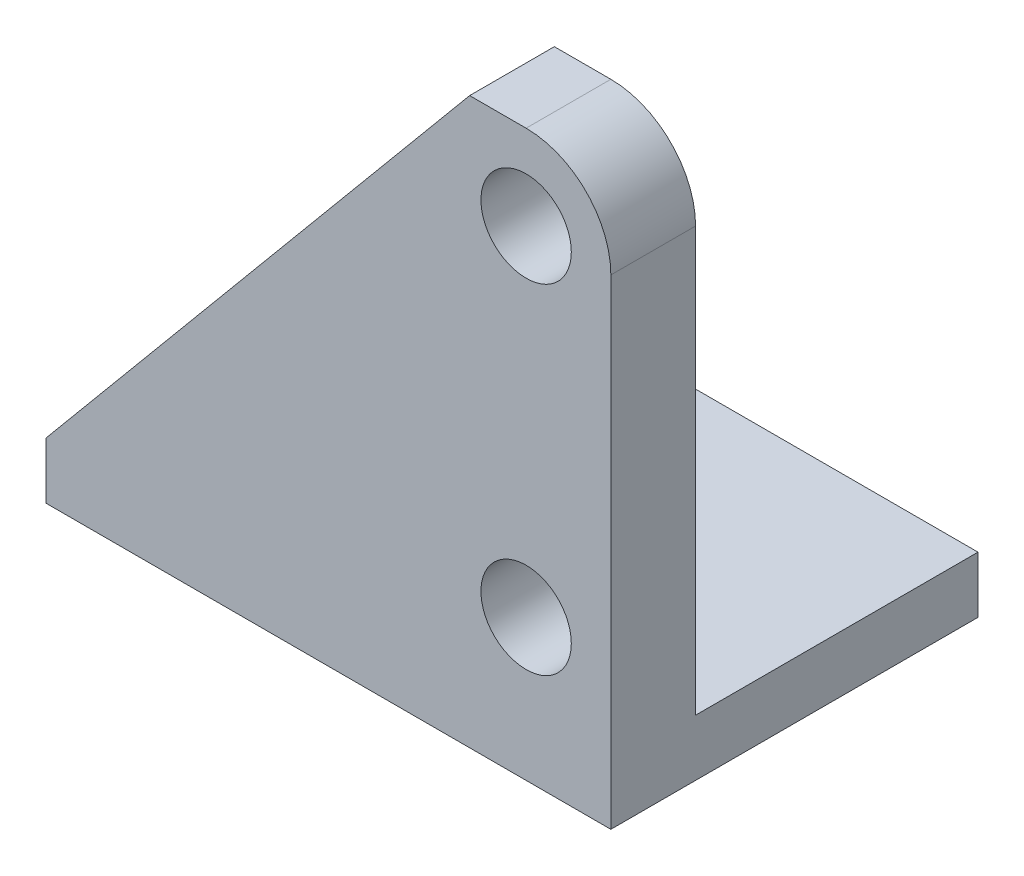
ISO-10303-21;
HEADER;
FILE_DESCRIPTION(('STEP AP214'),'2;1');
FILE_NAME('part.step','',(''),(''),'','','');
FILE_SCHEMA(('AUTOMOTIVE_DESIGN { 1 0 10303 214 1 1 1 1 }'));
ENDSEC;
DATA;
#1=APPLICATION_CONTEXT('core data for automotive mechanical design processes');
#2=APPLICATION_PROTOCOL_DEFINITION('international standard','automotive_design',2000,#1);
#3=PRODUCT_CONTEXT('',#1,'mechanical');
#4=PRODUCT('Part','Part','',(#3));
#5=PRODUCT_RELATED_PRODUCT_CATEGORY('part','',(#4));
#6=PRODUCT_DEFINITION_FORMATION('','',#4);
#7=PRODUCT_DEFINITION_CONTEXT('part definition',#1,'design');
#8=PRODUCT_DEFINITION('design','',#6,#7);
#9=PRODUCT_DEFINITION_SHAPE('','',#8);
#10=(LENGTH_UNIT() NAMED_UNIT(*) SI_UNIT(.MILLI.,.METRE.));
#11=(NAMED_UNIT(*) PLANE_ANGLE_UNIT() SI_UNIT($,.RADIAN.));
#12=(NAMED_UNIT(*) SI_UNIT($,.STERADIAN.) SOLID_ANGLE_UNIT());
#13=UNCERTAINTY_MEASURE_WITH_UNIT(LENGTH_MEASURE(1.E-05),#10,'distance_accuracy_value','');
#14=(GEOMETRIC_REPRESENTATION_CONTEXT(3) GLOBAL_UNCERTAINTY_ASSIGNED_CONTEXT((#13)) GLOBAL_UNIT_ASSIGNED_CONTEXT((#10,
#11,#12)) REPRESENTATION_CONTEXT('',''));
#15=CARTESIAN_POINT('',(0.,0.,0.));
#16=DIRECTION('',(0.,0.,1.));
#17=DIRECTION('',(1.,0.,0.));
#18=AXIS2_PLACEMENT_3D('',#15,#16,#17);
#19=CARTESIAN_POINT('',(17.,17.,3.));
#20=DIRECTION('',(0.,0.,1.));
#21=DIRECTION('',(1.,0.,0.));
#22=AXIS2_PLACEMENT_3D('',#19,#20,#21);
#23=PLANE('',#22);
#24=DIRECTION('',(0.64018439966448,0.768221279597376,0.));
#25=VECTOR('',#24,1.);
#26=CARTESIAN_POINT('',(0.,1.99999999999999,3.));
#27=LINE('',#26,#25);
#28=CARTESIAN_POINT('',(0.,1.99999999999999,3.));
#29=VERTEX_POINT('',#28);
#30=CARTESIAN_POINT('',(15.,20.,3.));
#31=VERTEX_POINT('',#30);
#32=EDGE_CURVE('E50',#29,#31,#27,.T.);
#33=ORIENTED_EDGE('',*,*,#32,.F.);
#34=DIRECTION('',(0.,-1.,0.));
#35=VECTOR('',#34,1.);
#36=CARTESIAN_POINT('',(0.,0.,3.));
#37=LINE('',#36,#35);
#38=CARTESIAN_POINT('',(0.,0.,3.));
#39=VERTEX_POINT('',#38);
#40=EDGE_CURVE('E80',#29,#39,#37,.T.);
#41=ORIENTED_EDGE('',*,*,#40,.T.);
#42=DIRECTION('',(1.,0.,0.));
#43=VECTOR('',#42,1.);
#44=CARTESIAN_POINT('',(0.,0.,3.));
#45=LINE('',#44,#43);
#46=CARTESIAN_POINT('',(20.,0.,3.));
#47=VERTEX_POINT('',#46);
#48=EDGE_CURVE('E117',#39,#47,#45,.T.);
#49=ORIENTED_EDGE('',*,*,#48,.T.);
#50=DIRECTION('',(0.,1.,0.));
#51=VECTOR('',#50,1.);
#52=CARTESIAN_POINT('',(20.,0.,3.));
#53=LINE('',#52,#51);
#54=CARTESIAN_POINT('',(20.,17.,3.));
#55=VERTEX_POINT('',#54);
#56=EDGE_CURVE('E120',#47,#55,#53,.T.);
#57=ORIENTED_EDGE('',*,*,#56,.T.);
#58=CARTESIAN_POINT('',(17.,17.,3.));
#59=DIRECTION('',(0.,0.,1.));
#60=DIRECTION('',(1.,0.,0.));
#61=AXIS2_PLACEMENT_3D('',#58,#59,#60);
#62=CIRCLE('',#61,3.);
#63=CARTESIAN_POINT('',(17.,20.,3.));
#64=VERTEX_POINT('',#63);
#65=EDGE_CURVE('E59',#55,#64,#62,.T.);
#66=ORIENTED_EDGE('',*,*,#65,.T.);
#67=DIRECTION('',(-1.,0.,0.));
#68=VECTOR('',#67,1.);
#69=CARTESIAN_POINT('',(0.,20.,3.));
#70=LINE('',#69,#68);
#71=EDGE_CURVE('E113',#64,#31,#70,.T.);
#72=ORIENTED_EDGE('',*,*,#71,.T.);
#73=EDGE_LOOP('',(#33,#41,#49,#57,#66,#72));
#74=FACE_BOUND('',#73,.T.);
#75=CARTESIAN_POINT('',(17.,17.,3.));
#76=DIRECTION('',(0.,0.,1.));
#77=DIRECTION('',(1.,0.,0.));
#78=AXIS2_PLACEMENT_3D('',#75,#76,#77);
#79=CIRCLE('',#78,1.6);
#80=CARTESIAN_POINT('',(18.6,17.,3.));
#81=VERTEX_POINT('',#80);
#82=EDGE_CURVE('E134',#81,#81,#79,.T.);
#83=ORIENTED_EDGE('',*,*,#82,.F.);
#84=EDGE_LOOP('',(#83));
#85=FACE_BOUND('',#84,.T.);
#86=CARTESIAN_POINT('',(17.0000000000002,5.,3.));
#87=DIRECTION('',(0.,0.,1.));
#88=DIRECTION('',(1.,0.,0.));
#89=AXIS2_PLACEMENT_3D('',#86,#87,#88);
#90=CIRCLE('',#89,1.6);
#91=CARTESIAN_POINT('',(18.6000000000002,5.,3.));
#92=VERTEX_POINT('',#91);
#93=EDGE_CURVE('E172',#92,#92,#90,.T.);
#94=ORIENTED_EDGE('',*,*,#93,.F.);
#95=EDGE_LOOP('',(#94));
#96=FACE_BOUND('',#95,.T.);
#97=ADVANCED_FACE('F35',(#74,#85,#96),#23,.T.);
#98=CARTESIAN_POINT('',(17.,17.,0.));
#99=DIRECTION('',(0.,0.,1.));
#100=DIRECTION('',(1.,0.,0.));
#101=AXIS2_PLACEMENT_3D('',#98,#99,#100);
#102=PLANE('',#101);
#103=DIRECTION('',(-1.,0.,0.));
#104=VECTOR('',#103,1.);
#105=CARTESIAN_POINT('',(17.,2.,0.));
#106=LINE('',#105,#104);
#107=CARTESIAN_POINT('',(20.,2.,0.));
#108=VERTEX_POINT('',#107);
#109=CARTESIAN_POINT('',(0.,1.99999999999999,0.));
#110=VERTEX_POINT('',#109);
#111=EDGE_CURVE('E167',#108,#110,#106,.T.);
#112=ORIENTED_EDGE('',*,*,#111,.T.);
#113=DIRECTION('',(0.64018439966448,0.768221279597376,0.));
#114=VECTOR('',#113,1.);
#115=CARTESIAN_POINT('',(14.344262295082,19.2131147540984,0.));
#116=LINE('',#115,#114);
#117=CARTESIAN_POINT('',(15.,20.,0.));
#118=VERTEX_POINT('',#117);
#119=EDGE_CURVE('E106',#110,#118,#116,.T.);
#120=ORIENTED_EDGE('',*,*,#119,.T.);
#121=DIRECTION('',(-1.,0.,0.));
#122=VECTOR('',#121,1.);
#123=CARTESIAN_POINT('',(0.,20.,0.));
#124=LINE('',#123,#122);
#125=CARTESIAN_POINT('',(17.,20.,0.));
#126=VERTEX_POINT('',#125);
#127=EDGE_CURVE('E118',#126,#118,#124,.T.);
#128=ORIENTED_EDGE('',*,*,#127,.F.);
#129=CARTESIAN_POINT('',(17.,17.,0.));
#130=DIRECTION('',(0.,0.,1.));
#131=DIRECTION('',(1.,0.,0.));
#132=AXIS2_PLACEMENT_3D('',#129,#130,#131);
#133=CIRCLE('',#132,3.);
#134=CARTESIAN_POINT('',(20.,17.,0.));
#135=VERTEX_POINT('',#134);
#136=EDGE_CURVE('E74',#135,#126,#133,.T.);
#137=ORIENTED_EDGE('',*,*,#136,.F.);
#138=DIRECTION('',(0.,1.,0.));
#139=VECTOR('',#138,1.);
#140=CARTESIAN_POINT('',(20.,0.,0.));
#141=LINE('',#140,#139);
#142=EDGE_CURVE('E132',#108,#135,#141,.T.);
#143=ORIENTED_EDGE('',*,*,#142,.F.);
#144=EDGE_LOOP('',(#112,#120,#128,#137,#143));
#145=FACE_BOUND('',#144,.T.);
#146=CARTESIAN_POINT('',(17.,17.,0.));
#147=DIRECTION('',(0.,0.,1.));
#148=DIRECTION('',(1.,0.,0.));
#149=AXIS2_PLACEMENT_3D('',#146,#147,#148);
#150=CIRCLE('',#149,1.6);
#151=CARTESIAN_POINT('',(18.6,17.,0.));
#152=VERTEX_POINT('',#151);
#153=EDGE_CURVE('E125',#152,#152,#150,.T.);
#154=ORIENTED_EDGE('',*,*,#153,.T.);
#155=EDGE_LOOP('',(#154));
#156=FACE_BOUND('',#155,.T.);
#157=CARTESIAN_POINT('',(17.0000000000002,5.,0.));
#158=DIRECTION('',(0.,0.,1.));
#159=DIRECTION('',(1.,0.,0.));
#160=AXIS2_PLACEMENT_3D('',#157,#158,#159);
#161=CIRCLE('',#160,1.6);
#162=CARTESIAN_POINT('',(18.6000000000002,5.,0.));
#163=VERTEX_POINT('',#162);
#164=EDGE_CURVE('E171',#163,#163,#161,.T.);
#165=ORIENTED_EDGE('',*,*,#164,.T.);
#166=EDGE_LOOP('',(#165));
#167=FACE_BOUND('',#166,.T.);
#168=ADVANCED_FACE('F182',(#145,#156,#167),#102,.F.);
#169=CARTESIAN_POINT('',(0.,0.,3.));
#170=DIRECTION('',(1.,0.,0.));
#171=DIRECTION('',(0.,0.,-1.));
#172=AXIS2_PLACEMENT_3D('',#169,#170,#171);
#173=PLANE('',#172);
#174=ORIENTED_EDGE('',*,*,#40,.F.);
#175=DIRECTION('',(0.,0.,1.));
#176=VECTOR('',#175,1.);
#177=CARTESIAN_POINT('',(0.,1.99999999999999,-17.));
#178=LINE('',#177,#176);
#179=EDGE_CURVE('E103',#110,#29,#178,.T.);
#180=ORIENTED_EDGE('',*,*,#179,.F.);
#181=DIRECTION('',(0.,0.,1.));
#182=VECTOR('',#181,1.);
#183=CARTESIAN_POINT('',(0.,1.99999999999999,-10.));
#184=LINE('',#183,#182);
#185=CARTESIAN_POINT('',(0.,1.99999999999999,-10.));
#186=VERTEX_POINT('',#185);
#187=EDGE_CURVE('E162',#186,#110,#184,.T.);
#188=ORIENTED_EDGE('',*,*,#187,.F.);
#189=DIRECTION('',(0.,-1.,0.));
#190=VECTOR('',#189,1.);
#191=CARTESIAN_POINT('',(0.,0.,-10.));
#192=LINE('',#191,#190);
#193=CARTESIAN_POINT('',(0.,0.,-10.));
#194=VERTEX_POINT('',#193);
#195=EDGE_CURVE('E160',#186,#194,#192,.T.);
#196=ORIENTED_EDGE('',*,*,#195,.T.);
#197=DIRECTION('',(0.,0.,-1.));
#198=VECTOR('',#197,1.);
#199=CARTESIAN_POINT('',(0.,0.,3.));
#200=LINE('',#199,#198);
#201=EDGE_CURVE('E11',#39,#194,#200,.T.);
#202=ORIENTED_EDGE('',*,*,#201,.F.);
#203=EDGE_LOOP('',(#174,#180,#188,#196,#202));
#204=FACE_BOUND('',#203,.T.);
#205=ADVANCED_FACE('F37',(#204),#173,.F.);
#206=CARTESIAN_POINT('',(0.,0.,3.));
#207=DIRECTION('',(0.,1.,0.));
#208=DIRECTION('',(0.,0.,1.));
#209=AXIS2_PLACEMENT_3D('',#206,#207,#208);
#210=PLANE('',#209);
#211=ORIENTED_EDGE('',*,*,#201,.T.);
#212=DIRECTION('',(1.,0.,0.));
#213=VECTOR('',#212,1.);
#214=CARTESIAN_POINT('',(20.,0.,-10.));
#215=LINE('',#214,#213);
#216=CARTESIAN_POINT('',(20.,0.,-10.));
#217=VERTEX_POINT('',#216);
#218=EDGE_CURVE('E154',#194,#217,#215,.T.);
#219=ORIENTED_EDGE('',*,*,#218,.T.);
#220=DIRECTION('',(0.,0.,-1.));
#221=VECTOR('',#220,1.);
#222=CARTESIAN_POINT('',(20.,0.,3.));
#223=LINE('',#222,#221);
#224=EDGE_CURVE('E43',#47,#217,#223,.T.);
#225=ORIENTED_EDGE('',*,*,#224,.F.);
#226=ORIENTED_EDGE('',*,*,#48,.F.);
#227=EDGE_LOOP('',(#211,#219,#225,#226));
#228=FACE_BOUND('',#227,.T.);
#229=ADVANCED_FACE('F158',(#228),#210,.F.);
#230=CARTESIAN_POINT('',(20.,0.,3.));
#231=DIRECTION('',(-1.,0.,0.));
#232=DIRECTION('',(0.,0.,1.));
#233=AXIS2_PLACEMENT_3D('',#230,#231,#232);
#234=PLANE('',#233);
#235=DIRECTION('',(0.,0.,-1.));
#236=VECTOR('',#235,1.);
#237=CARTESIAN_POINT('',(20.,17.,3.));
#238=LINE('',#237,#236);
#239=EDGE_CURVE('E137',#55,#135,#238,.T.);
#240=ORIENTED_EDGE('',*,*,#239,.F.);
#241=ORIENTED_EDGE('',*,*,#56,.F.);
#242=ORIENTED_EDGE('',*,*,#224,.T.);
#243=DIRECTION('',(0.,1.,0.));
#244=VECTOR('',#243,1.);
#245=CARTESIAN_POINT('',(20.,0.,-10.));
#246=LINE('',#245,#244);
#247=CARTESIAN_POINT('',(20.,2.,-10.));
#248=VERTEX_POINT('',#247);
#249=EDGE_CURVE('E146',#217,#248,#246,.T.);
#250=ORIENTED_EDGE('',*,*,#249,.T.);
#251=DIRECTION('',(0.,0.,1.));
#252=VECTOR('',#251,1.);
#253=CARTESIAN_POINT('',(20.,2.,-10.));
#254=LINE('',#253,#252);
#255=EDGE_CURVE('E159',#248,#108,#254,.T.);
#256=ORIENTED_EDGE('',*,*,#255,.T.);
#257=ORIENTED_EDGE('',*,*,#142,.T.);
#258=EDGE_LOOP('',(#240,#241,#242,#250,#256,#257));
#259=FACE_BOUND('',#258,.T.);
#260=ADVANCED_FACE('F144',(#259),#234,.F.);
#261=CARTESIAN_POINT('',(17.,17.,3.));
#262=DIRECTION('',(0.,0.,-1.));
#263=DIRECTION('',(-1.,0.,0.));
#264=AXIS2_PLACEMENT_3D('',#261,#262,#263);
#265=CYLINDRICAL_SURFACE('',#264,3.);
#266=ORIENTED_EDGE('',*,*,#136,.T.);
#267=DIRECTION('',(0.,0.,-1.));
#268=VECTOR('',#267,1.);
#269=CARTESIAN_POINT('',(17.,20.,3.));
#270=LINE('',#269,#268);
#271=EDGE_CURVE('E131',#64,#126,#270,.T.);
#272=ORIENTED_EDGE('',*,*,#271,.F.);
#273=ORIENTED_EDGE('',*,*,#65,.F.);
#274=ORIENTED_EDGE('',*,*,#239,.T.);
#275=EDGE_LOOP('',(#266,#272,#273,#274));
#276=FACE_BOUND('',#275,.T.);
#277=ADVANCED_FACE('F197',(#276),#265,.T.);
#278=CARTESIAN_POINT('',(0.,20.,3.));
#279=DIRECTION('',(0.,-1.,0.));
#280=DIRECTION('',(0.,0.,-1.));
#281=AXIS2_PLACEMENT_3D('',#278,#279,#280);
#282=PLANE('',#281);
#283=ORIENTED_EDGE('',*,*,#127,.T.);
#284=DIRECTION('',(0.,0.,1.));
#285=VECTOR('',#284,1.);
#286=CARTESIAN_POINT('',(15.,20.,-17.));
#287=LINE('',#286,#285);
#288=EDGE_CURVE('E109',#118,#31,#287,.T.);
#289=ORIENTED_EDGE('',*,*,#288,.T.);
#290=ORIENTED_EDGE('',*,*,#71,.F.);
#291=ORIENTED_EDGE('',*,*,#271,.T.);
#292=EDGE_LOOP('',(#283,#289,#290,#291));
#293=FACE_BOUND('',#292,.T.);
#294=ADVANCED_FACE('F188',(#293),#282,.F.);
#295=CARTESIAN_POINT('',(17.,17.,3.));
#296=DIRECTION('',(0.,0.,-1.));
#297=DIRECTION('',(-1.,0.,0.));
#298=AXIS2_PLACEMENT_3D('',#295,#296,#297);
#299=CYLINDRICAL_SURFACE('',#298,1.6);
#300=ORIENTED_EDGE('',*,*,#82,.T.);
#301=EDGE_LOOP('',(#300));
#302=FACE_BOUND('',#301,.T.);
#303=ORIENTED_EDGE('',*,*,#153,.F.);
#304=EDGE_LOOP('',(#303));
#305=FACE_BOUND('',#304,.T.);
#306=ADVANCED_FACE('F185',(#302,#305),#299,.F.);
#307=CARTESIAN_POINT('',(17.0000000000002,5.,3.));
#308=DIRECTION('',(0.,0.,-1.));
#309=DIRECTION('',(-1.,0.,0.));
#310=AXIS2_PLACEMENT_3D('',#307,#308,#309);
#311=CYLINDRICAL_SURFACE('',#310,1.6);
#312=ORIENTED_EDGE('',*,*,#93,.T.);
#313=EDGE_LOOP('',(#312));
#314=FACE_BOUND('',#313,.T.);
#315=ORIENTED_EDGE('',*,*,#164,.F.);
#316=EDGE_LOOP('',(#315));
#317=FACE_BOUND('',#316,.T.);
#318=ADVANCED_FACE('F187',(#314,#317),#311,.F.);
#319=CARTESIAN_POINT('',(20.,2.,-10.));
#320=DIRECTION('',(0.,1.,0.));
#321=DIRECTION('',(-1.,0.,0.));
#322=AXIS2_PLACEMENT_3D('',#319,#320,#321);
#323=PLANE('',#322);
#324=ORIENTED_EDGE('',*,*,#111,.F.);
#325=ORIENTED_EDGE('',*,*,#255,.F.);
#326=DIRECTION('',(-1.,0.,0.));
#327=VECTOR('',#326,1.);
#328=CARTESIAN_POINT('',(20.,2.,-10.));
#329=LINE('',#328,#327);
#330=EDGE_CURVE('E156',#248,#186,#329,.T.);
#331=ORIENTED_EDGE('',*,*,#330,.T.);
#332=ORIENTED_EDGE('',*,*,#187,.T.);
#333=EDGE_LOOP('',(#324,#325,#331,#332));
#334=FACE_BOUND('',#333,.T.);
#335=ADVANCED_FACE('F194',(#334),#323,.T.);
#336=CARTESIAN_POINT('',(0.,0.,-10.));
#337=DIRECTION('',(0.,0.,1.));
#338=DIRECTION('',(1.,0.,0.));
#339=AXIS2_PLACEMENT_3D('',#336,#337,#338);
#340=PLANE('',#339);
#341=ORIENTED_EDGE('',*,*,#249,.F.);
#342=ORIENTED_EDGE('',*,*,#218,.F.);
#343=ORIENTED_EDGE('',*,*,#195,.F.);
#344=ORIENTED_EDGE('',*,*,#330,.F.);
#345=EDGE_LOOP('',(#341,#342,#343,#344));
#346=FACE_BOUND('',#345,.T.);
#347=ADVANCED_FACE('F152',(#346),#340,.F.);
#348=CARTESIAN_POINT('',(0.,1.99999999999999,-17.));
#349=DIRECTION('',(0.768221279597376,-0.64018439966448,0.));
#350=DIRECTION('',(0.64018439966448,0.768221279597376,0.));
#351=AXIS2_PLACEMENT_3D('',#348,#349,#350);
#352=PLANE('',#351);
#353=ORIENTED_EDGE('',*,*,#179,.T.);
#354=ORIENTED_EDGE('',*,*,#32,.T.);
#355=ORIENTED_EDGE('',*,*,#288,.F.);
#356=ORIENTED_EDGE('',*,*,#119,.F.);
#357=EDGE_LOOP('',(#353,#354,#355,#356));
#358=FACE_BOUND('',#357,.T.);
#359=ADVANCED_FACE('F104',(#358),#352,.F.);
#360=CLOSED_SHELL('',(#97,#168,#205,#229,#260,#277,#294,#306,#318,#335,#347,#359));
#361=MANIFOLD_SOLID_BREP('B2',#360);
#362=ADVANCED_BREP_SHAPE_REPRESENTATION('',(#18,#361),#14);
#363=SHAPE_DEFINITION_REPRESENTATION(#9,#362);
ENDSEC;
END-ISO-10303-21;
